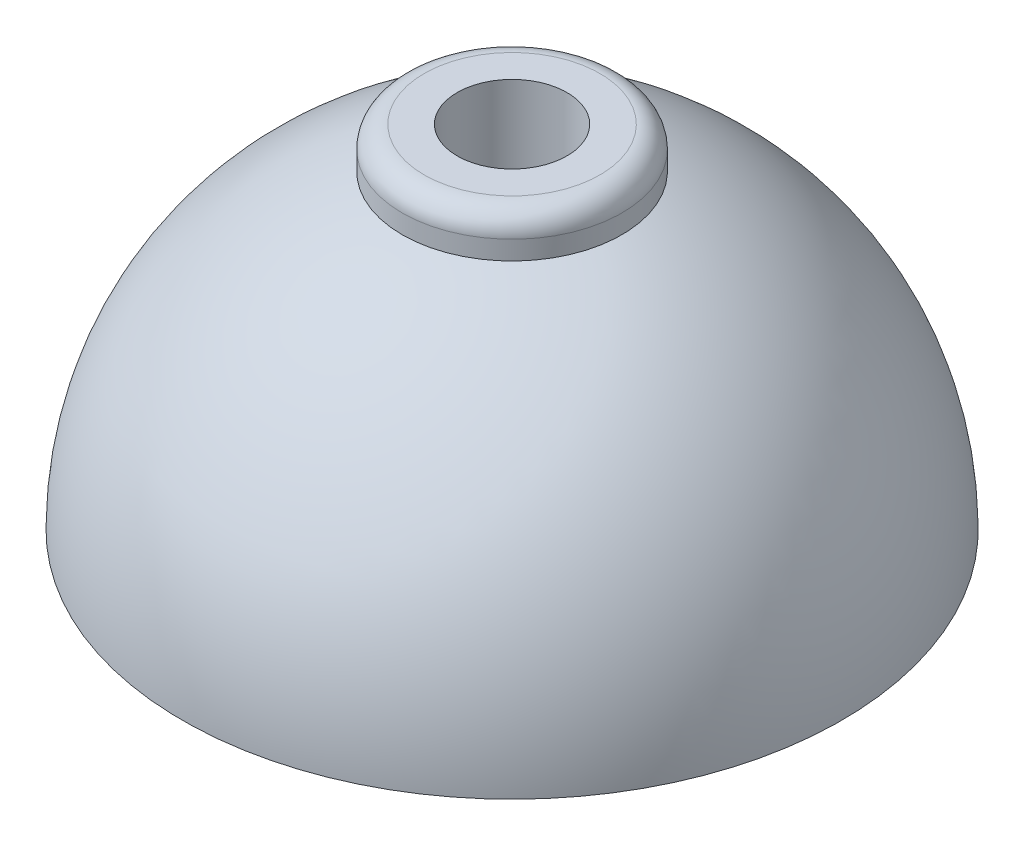
ISO-10303-21;
HEADER;
FILE_DESCRIPTION(('STEP AP214'),'2;1');
FILE_NAME('part.step','',(''),(''),'','','');
FILE_SCHEMA(('AUTOMOTIVE_DESIGN { 1 0 10303 214 1 1 1 1 }'));
ENDSEC;
DATA;
#1=APPLICATION_CONTEXT('core data for automotive mechanical design processes');
#2=APPLICATION_PROTOCOL_DEFINITION('international standard','automotive_design',2000,#1);
#3=PRODUCT_CONTEXT('',#1,'mechanical');
#4=PRODUCT('Part','Part','',(#3));
#5=PRODUCT_RELATED_PRODUCT_CATEGORY('part','',(#4));
#6=PRODUCT_DEFINITION_FORMATION('','',#4);
#7=PRODUCT_DEFINITION_CONTEXT('part definition',#1,'design');
#8=PRODUCT_DEFINITION('design','',#6,#7);
#9=PRODUCT_DEFINITION_SHAPE('','',#8);
#10=(LENGTH_UNIT() NAMED_UNIT(*) SI_UNIT(.MILLI.,.METRE.));
#11=(NAMED_UNIT(*) PLANE_ANGLE_UNIT() SI_UNIT($,.RADIAN.));
#12=(NAMED_UNIT(*) SI_UNIT($,.STERADIAN.) SOLID_ANGLE_UNIT());
#13=UNCERTAINTY_MEASURE_WITH_UNIT(LENGTH_MEASURE(1.E-05),#10,'distance_accuracy_value','');
#14=(GEOMETRIC_REPRESENTATION_CONTEXT(3) GLOBAL_UNCERTAINTY_ASSIGNED_CONTEXT((#13)) GLOBAL_UNIT_ASSIGNED_CONTEXT((#10,
#11,#12)) REPRESENTATION_CONTEXT('',''));
#15=CARTESIAN_POINT('',(0.,0.,0.));
#16=DIRECTION('',(0.,0.,1.));
#17=DIRECTION('',(1.,0.,0.));
#18=AXIS2_PLACEMENT_3D('',#15,#16,#17);
#19=CARTESIAN_POINT('',(0.,0.,0.));
#20=DIRECTION('',(0.,-1.,0.));
#21=DIRECTION('',(0.,0.,-1.));
#22=AXIS2_PLACEMENT_3D('',#19,#20,#21);
#23=PLANE('',#22);
#24=CARTESIAN_POINT('',(0.,0.,0.));
#25=DIRECTION('',(0.,-1.,0.));
#26=DIRECTION('',(0.,0.,-1.));
#27=AXIS2_PLACEMENT_3D('',#24,#25,#26);
#28=CIRCLE('',#27,13.);
#29=CARTESIAN_POINT('',(0.,0.,-13.));
#30=VERTEX_POINT('',#29);
#31=EDGE_CURVE('E52',#30,#30,#28,.T.);
#32=ORIENTED_EDGE('',*,*,#31,.F.);
#33=EDGE_LOOP('',(#32));
#34=FACE_BOUND('',#33,.T.);
#35=CARTESIAN_POINT('',(0.,0.,0.));
#36=DIRECTION('',(0.,-1.,0.));
#37=DIRECTION('',(0.,0.,-1.));
#38=AXIS2_PLACEMENT_3D('',#35,#36,#37);
#39=CIRCLE('',#38,15.);
#40=CARTESIAN_POINT('',(0.,0.,-15.));
#41=VERTEX_POINT('',#40);
#42=EDGE_CURVE('E46',#41,#41,#39,.T.);
#43=ORIENTED_EDGE('',*,*,#42,.T.);
#44=EDGE_LOOP('',(#43));
#45=FACE_BOUND('',#44,.T.);
#46=ADVANCED_FACE('F31',(#34,#45),#23,.T.);
#47=CARTESIAN_POINT('',(0.,0.,0.));
#48=DIRECTION('',(0.,-1.,0.));
#49=DIRECTION('',(1.,0.,0.));
#50=AXIS2_PLACEMENT_3D('',#47,#48,#49);
#51=SPHERICAL_SURFACE('',#50,15.);
#52=CARTESIAN_POINT('',(0.,14.142135623731,0.));
#53=DIRECTION('',(0.,-1.,0.));
#54=DIRECTION('',(0.,0.,-1.));
#55=AXIS2_PLACEMENT_3D('',#52,#53,#54);
#56=CIRCLE('',#55,5.);
#57=CARTESIAN_POINT('',(0.,14.142135623731,-5.));
#58=VERTEX_POINT('',#57);
#59=EDGE_CURVE('E42',#58,#58,#56,.F.);
#60=ORIENTED_EDGE('',*,*,#59,.F.);
#61=EDGE_LOOP('',(#60));
#62=FACE_BOUND('',#61,.T.);
#63=ORIENTED_EDGE('',*,*,#42,.F.);
#64=EDGE_LOOP('',(#63));
#65=FACE_BOUND('',#64,.T.);
#66=ADVANCED_FACE('F83',(#62,#65),#51,.T.);
#67=CARTESIAN_POINT('',(0.,0.,0.));
#68=DIRECTION('',(0.,-1.,0.));
#69=DIRECTION('',(1.,0.,0.));
#70=AXIS2_PLACEMENT_3D('',#67,#68,#69);
#71=SPHERICAL_SURFACE('',#70,13.);
#72=CARTESIAN_POINT('',(0.,12.,0.));
#73=DIRECTION('',(0.,-1.,0.));
#74=DIRECTION('',(0.,0.,-1.));
#75=AXIS2_PLACEMENT_3D('',#72,#73,#74);
#76=CIRCLE('',#75,5.);
#77=CARTESIAN_POINT('',(0.,12.,-5.));
#78=VERTEX_POINT('',#77);
#79=EDGE_CURVE('E49',#78,#78,#76,.F.);
#80=ORIENTED_EDGE('',*,*,#79,.T.);
#81=EDGE_LOOP('',(#80));
#82=FACE_BOUND('',#81,.T.);
#83=ORIENTED_EDGE('',*,*,#31,.T.);
#84=EDGE_LOOP('',(#83));
#85=FACE_BOUND('',#84,.T.);
#86=ADVANCED_FACE('F88',(#82,#85),#71,.F.);
#87=CARTESIAN_POINT('',(0.,10.,0.));
#88=DIRECTION('',(0.,1.,0.));
#89=DIRECTION('',(0.,0.,1.));
#90=AXIS2_PLACEMENT_3D('',#87,#88,#89);
#91=PLANE('',#90);
#92=CARTESIAN_POINT('',(0.,10.,0.));
#93=DIRECTION('',(0.,1.,0.));
#94=DIRECTION('',(0.,0.,1.));
#95=AXIS2_PLACEMENT_3D('',#92,#93,#94);
#96=CIRCLE('',#95,2.5);
#97=CARTESIAN_POINT('',(0.,10.,2.5));
#98=VERTEX_POINT('',#97);
#99=EDGE_CURVE('E60',#98,#98,#96,.F.);
#100=ORIENTED_EDGE('',*,*,#99,.F.);
#101=EDGE_LOOP('',(#100));
#102=FACE_BOUND('',#101,.T.);
#103=CARTESIAN_POINT('',(0.,10.,0.));
#104=DIRECTION('',(0.,1.,0.));
#105=DIRECTION('',(0.,0.,1.));
#106=AXIS2_PLACEMENT_3D('',#103,#104,#105);
#107=CIRCLE('',#106,5.);
#108=CARTESIAN_POINT('',(0.,10.,5.));
#109=VERTEX_POINT('',#108);
#110=EDGE_CURVE('E53',#109,#109,#107,.T.);
#111=ORIENTED_EDGE('',*,*,#110,.F.);
#112=EDGE_LOOP('',(#111));
#113=FACE_BOUND('',#112,.T.);
#114=ADVANCED_FACE('F95',(#102,#113),#91,.F.);
#115=CARTESIAN_POINT('',(0.,10.,0.));
#116=DIRECTION('',(0.,1.,0.));
#117=DIRECTION('',(0.,0.,1.));
#118=AXIS2_PLACEMENT_3D('',#115,#116,#117);
#119=CYLINDRICAL_SURFACE('',#118,5.);
#120=ORIENTED_EDGE('',*,*,#110,.T.);
#121=EDGE_LOOP('',(#120));
#122=FACE_BOUND('',#121,.T.);
#123=ORIENTED_EDGE('',*,*,#79,.F.);
#124=EDGE_LOOP('',(#123));
#125=FACE_BOUND('',#124,.T.);
#126=ADVANCED_FACE('F79',(#122,#125),#119,.T.);
#127=CARTESIAN_POINT('',(0.,15.,0.));
#128=DIRECTION('',(0.,1.,0.));
#129=DIRECTION('',(0.,0.,1.));
#130=AXIS2_PLACEMENT_3D('',#127,#128,#129);
#131=CIRCLE('',#130,5.);
#132=CARTESIAN_POINT('',(0.,15.,5.));
#133=VERTEX_POINT('',#132);
#134=EDGE_CURVE('E10',#133,#133,#131,.F.);
#135=ORIENTED_EDGE('',*,*,#134,.T.);
#136=EDGE_LOOP('',(#135));
#137=FACE_BOUND('',#136,.T.);
#138=ORIENTED_EDGE('',*,*,#59,.T.);
#139=EDGE_LOOP('',(#138));
#140=FACE_BOUND('',#139,.T.);
#141=ADVANCED_FACE('F72',(#137,#140),#119,.T.);
#142=CARTESIAN_POINT('',(0.,16.,0.));
#143=DIRECTION('',(0.,1.,0.));
#144=DIRECTION('',(0.,0.,1.));
#145=AXIS2_PLACEMENT_3D('',#142,#143,#144);
#146=PLANE('',#145);
#147=CARTESIAN_POINT('',(0.,16.,0.));
#148=DIRECTION('',(0.,1.,0.));
#149=DIRECTION('',(0.,0.,1.));
#150=AXIS2_PLACEMENT_3D('',#147,#148,#149);
#151=CIRCLE('',#150,4.);
#152=CARTESIAN_POINT('',(0.,16.,4.));
#153=VERTEX_POINT('',#152);
#154=EDGE_CURVE('E38',#153,#153,#151,.T.);
#155=ORIENTED_EDGE('',*,*,#154,.T.);
#156=EDGE_LOOP('',(#155));
#157=FACE_BOUND('',#156,.T.);
#158=CARTESIAN_POINT('',(0.,16.,0.));
#159=DIRECTION('',(0.,1.,0.));
#160=DIRECTION('',(0.,0.,1.));
#161=AXIS2_PLACEMENT_3D('',#158,#159,#160);
#162=CIRCLE('',#161,2.5);
#163=CARTESIAN_POINT('',(0.,16.,2.5));
#164=VERTEX_POINT('',#163);
#165=EDGE_CURVE('E63',#164,#164,#162,.T.);
#166=ORIENTED_EDGE('',*,*,#165,.F.);
#167=EDGE_LOOP('',(#166));
#168=FACE_BOUND('',#167,.T.);
#169=ADVANCED_FACE('F70',(#157,#168),#146,.T.);
#170=CARTESIAN_POINT('',(0.,16.,0.));
#171=DIRECTION('',(0.,-1.,0.));
#172=DIRECTION('',(0.,0.,-1.));
#173=AXIS2_PLACEMENT_3D('',#170,#171,#172);
#174=CYLINDRICAL_SURFACE('',#173,2.5);
#175=ORIENTED_EDGE('',*,*,#165,.T.);
#176=EDGE_LOOP('',(#175));
#177=FACE_BOUND('',#176,.T.);
#178=ORIENTED_EDGE('',*,*,#99,.T.);
#179=EDGE_LOOP('',(#178));
#180=FACE_BOUND('',#179,.T.);
#181=ADVANCED_FACE('F67',(#177,#180),#174,.F.);
#182=CARTESIAN_POINT('',(0.,15.,0.));
#183=DIRECTION('',(0.,1.,0.));
#184=DIRECTION('',(0.,0.,1.));
#185=AXIS2_PLACEMENT_3D('',#182,#183,#184);
#186=TOROIDAL_SURFACE('',#185,4.,1.);
#187=ORIENTED_EDGE('',*,*,#134,.F.);
#188=EDGE_LOOP('',(#187));
#189=FACE_BOUND('',#188,.T.);
#190=ORIENTED_EDGE('',*,*,#154,.F.);
#191=EDGE_LOOP('',(#190));
#192=FACE_BOUND('',#191,.T.);
#193=ADVANCED_FACE('F33',(#189,#192),#186,.T.);
#194=CLOSED_SHELL('',(#46,#66,#86,#114,#126,#141,#169,#181,#193));
#195=MANIFOLD_SOLID_BREP('B2',#194);
#196=ADVANCED_BREP_SHAPE_REPRESENTATION('',(#18,#195),#14);
#197=SHAPE_DEFINITION_REPRESENTATION(#9,#196);
ENDSEC;
END-ISO-10303-21;
